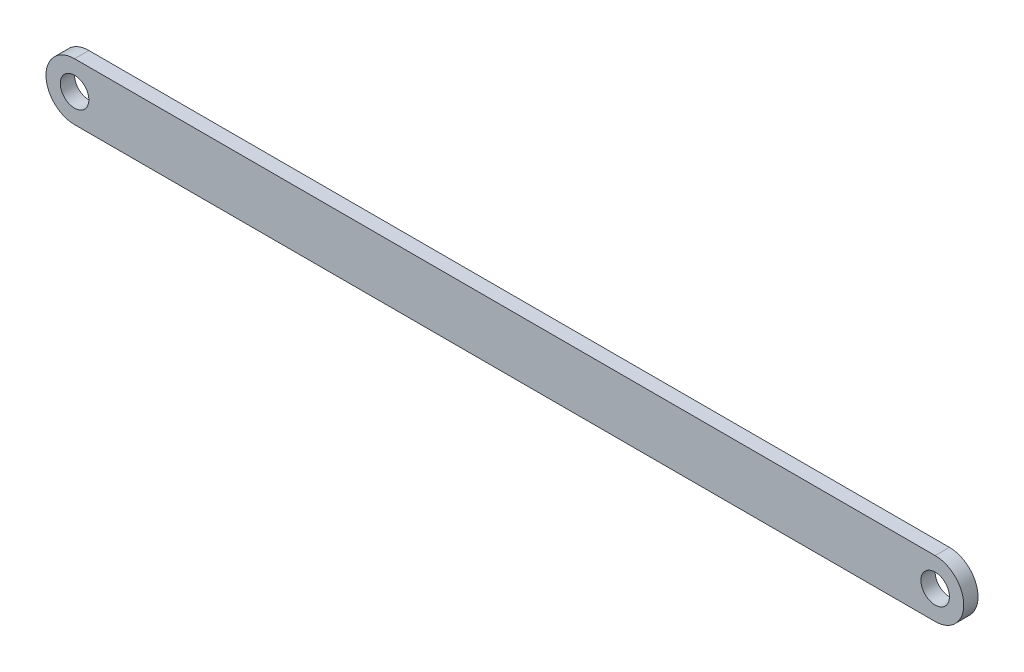
ISO-10303-21;
HEADER;
FILE_DESCRIPTION(('STEP AP214'),'2;1');
FILE_NAME('part.step','',(''),(''),'','','');
FILE_SCHEMA(('AUTOMOTIVE_DESIGN { 1 0 10303 214 1 1 1 1 }'));
ENDSEC;
DATA;
#1=APPLICATION_CONTEXT('core data for automotive mechanical design processes');
#2=APPLICATION_PROTOCOL_DEFINITION('international standard','automotive_design',2000,#1);
#3=PRODUCT_CONTEXT('',#1,'mechanical');
#4=PRODUCT('Part','Part','',(#3));
#5=PRODUCT_RELATED_PRODUCT_CATEGORY('part','',(#4));
#6=PRODUCT_DEFINITION_FORMATION('','',#4);
#7=PRODUCT_DEFINITION_CONTEXT('part definition',#1,'design');
#8=PRODUCT_DEFINITION('design','',#6,#7);
#9=PRODUCT_DEFINITION_SHAPE('','',#8);
#10=(LENGTH_UNIT() NAMED_UNIT(*) SI_UNIT(.MILLI.,.METRE.));
#11=(NAMED_UNIT(*) PLANE_ANGLE_UNIT() SI_UNIT($,.RADIAN.));
#12=(NAMED_UNIT(*) SI_UNIT($,.STERADIAN.) SOLID_ANGLE_UNIT());
#13=UNCERTAINTY_MEASURE_WITH_UNIT(LENGTH_MEASURE(1.E-05),#10,'distance_accuracy_value','');
#14=(GEOMETRIC_REPRESENTATION_CONTEXT(3) GLOBAL_UNCERTAINTY_ASSIGNED_CONTEXT((#13)) GLOBAL_UNIT_ASSIGNED_CONTEXT((#10,
#11,#12)) REPRESENTATION_CONTEXT('',''));
#15=CARTESIAN_POINT('',(0.,0.,0.));
#16=DIRECTION('',(0.,0.,1.));
#17=DIRECTION('',(1.,0.,0.));
#18=AXIS2_PLACEMENT_3D('',#15,#16,#17);
#19=CARTESIAN_POINT('',(30.13,0.,1.));
#20=DIRECTION('',(0.,0.,-1.));
#21=DIRECTION('',(-1.,0.,0.));
#22=AXIS2_PLACEMENT_3D('',#19,#20,#21);
#23=PLANE('',#22);
#24=CARTESIAN_POINT('',(30.13,0.,1.));
#25=DIRECTION('',(0.,0.,1.));
#26=DIRECTION('',(-1.,0.,0.));
#27=AXIS2_PLACEMENT_3D('',#24,#25,#26);
#28=CIRCLE('',#27,2.);
#29=CARTESIAN_POINT('',(30.13,-2.,1.));
#30=VERTEX_POINT('',#29);
#31=CARTESIAN_POINT('',(30.13,2.,1.));
#32=VERTEX_POINT('',#31);
#33=EDGE_CURVE('E96',#30,#32,#28,.T.);
#34=ORIENTED_EDGE('',*,*,#33,.T.);
#35=DIRECTION('',(-1.,0.,0.));
#36=VECTOR('',#35,1.);
#37=CARTESIAN_POINT('',(-30.13,2.,1.));
#38=LINE('',#37,#36);
#39=CARTESIAN_POINT('',(-30.13,2.,1.));
#40=VERTEX_POINT('',#39);
#41=EDGE_CURVE('E91',#32,#40,#38,.T.);
#42=ORIENTED_EDGE('',*,*,#41,.T.);
#43=CARTESIAN_POINT('',(-30.13,0.,1.));
#44=DIRECTION('',(0.,0.,1.));
#45=DIRECTION('',(1.,0.,0.));
#46=AXIS2_PLACEMENT_3D('',#43,#44,#45);
#47=CIRCLE('',#46,2.);
#48=CARTESIAN_POINT('',(-30.13,-2.,1.));
#49=VERTEX_POINT('',#48);
#50=EDGE_CURVE('E94',#40,#49,#47,.T.);
#51=ORIENTED_EDGE('',*,*,#50,.T.);
#52=DIRECTION('',(1.,0.,0.));
#53=VECTOR('',#52,1.);
#54=CARTESIAN_POINT('',(-30.13,-2.,1.));
#55=LINE('',#54,#53);
#56=EDGE_CURVE('E61',#49,#30,#55,.T.);
#57=ORIENTED_EDGE('',*,*,#56,.T.);
#58=EDGE_LOOP('',(#34,#42,#51,#57));
#59=FACE_BOUND('',#58,.T.);
#60=CARTESIAN_POINT('',(-30.13,0.,1.));
#61=DIRECTION('',(0.,0.,1.));
#62=DIRECTION('',(1.,0.,0.));
#63=AXIS2_PLACEMENT_3D('',#60,#61,#62);
#64=CIRCLE('',#63,1.);
#65=CARTESIAN_POINT('',(-29.13,0.,1.));
#66=VERTEX_POINT('',#65);
#67=EDGE_CURVE('E116',#66,#66,#64,.T.);
#68=ORIENTED_EDGE('',*,*,#67,.F.);
#69=EDGE_LOOP('',(#68));
#70=FACE_BOUND('',#69,.T.);
#71=CARTESIAN_POINT('',(30.13,0.,1.));
#72=DIRECTION('',(0.,0.,1.));
#73=DIRECTION('',(1.,0.,0.));
#74=AXIS2_PLACEMENT_3D('',#71,#72,#73);
#75=CIRCLE('',#74,1.);
#76=CARTESIAN_POINT('',(31.13,0.,1.));
#77=VERTEX_POINT('',#76);
#78=EDGE_CURVE('E138',#77,#77,#75,.T.);
#79=ORIENTED_EDGE('',*,*,#78,.F.);
#80=EDGE_LOOP('',(#79));
#81=FACE_BOUND('',#80,.T.);
#82=ADVANCED_FACE('F43',(#59,#70,#81),#23,.F.);
#83=CARTESIAN_POINT('',(30.13,0.,0.));
#84=DIRECTION('',(0.,0.,-1.));
#85=DIRECTION('',(-1.,0.,0.));
#86=AXIS2_PLACEMENT_3D('',#83,#84,#85);
#87=PLANE('',#86);
#88=CARTESIAN_POINT('',(-30.13,0.,0.));
#89=DIRECTION('',(0.,0.,1.));
#90=DIRECTION('',(1.,0.,0.));
#91=AXIS2_PLACEMENT_3D('',#88,#89,#90);
#92=CIRCLE('',#91,1.);
#93=CARTESIAN_POINT('',(-29.13,0.,0.));
#94=VERTEX_POINT('',#93);
#95=EDGE_CURVE('E134',#94,#94,#92,.T.);
#96=ORIENTED_EDGE('',*,*,#95,.T.);
#97=EDGE_LOOP('',(#96));
#98=FACE_BOUND('',#97,.T.);
#99=CARTESIAN_POINT('',(30.13,0.,0.));
#100=DIRECTION('',(0.,0.,1.));
#101=DIRECTION('',(-1.,0.,0.));
#102=AXIS2_PLACEMENT_3D('',#99,#100,#101);
#103=CIRCLE('',#102,2.);
#104=CARTESIAN_POINT('',(30.13,-2.,0.));
#105=VERTEX_POINT('',#104);
#106=CARTESIAN_POINT('',(30.13,2.,0.));
#107=VERTEX_POINT('',#106);
#108=EDGE_CURVE('E112',#105,#107,#103,.T.);
#109=ORIENTED_EDGE('',*,*,#108,.F.);
#110=DIRECTION('',(1.,0.,0.));
#111=VECTOR('',#110,1.);
#112=CARTESIAN_POINT('',(-30.13,-2.,0.));
#113=LINE('',#112,#111);
#114=CARTESIAN_POINT('',(-30.13,-2.,0.));
#115=VERTEX_POINT('',#114);
#116=EDGE_CURVE('E84',#115,#105,#113,.T.);
#117=ORIENTED_EDGE('',*,*,#116,.F.);
#118=CARTESIAN_POINT('',(-30.13,0.,0.));
#119=DIRECTION('',(0.,0.,1.));
#120=DIRECTION('',(1.,0.,0.));
#121=AXIS2_PLACEMENT_3D('',#118,#119,#120);
#122=CIRCLE('',#121,2.);
#123=CARTESIAN_POINT('',(-30.13,2.,0.));
#124=VERTEX_POINT('',#123);
#125=EDGE_CURVE('E78',#124,#115,#122,.T.);
#126=ORIENTED_EDGE('',*,*,#125,.F.);
#127=DIRECTION('',(-1.,0.,0.));
#128=VECTOR('',#127,1.);
#129=CARTESIAN_POINT('',(-30.13,2.,0.));
#130=LINE('',#129,#128);
#131=EDGE_CURVE('E101',#107,#124,#130,.T.);
#132=ORIENTED_EDGE('',*,*,#131,.F.);
#133=EDGE_LOOP('',(#109,#117,#126,#132));
#134=FACE_BOUND('',#133,.T.);
#135=CARTESIAN_POINT('',(30.13,0.,0.));
#136=DIRECTION('',(0.,0.,1.));
#137=DIRECTION('',(1.,0.,0.));
#138=AXIS2_PLACEMENT_3D('',#135,#136,#137);
#139=CIRCLE('',#138,1.);
#140=CARTESIAN_POINT('',(31.13,0.,0.));
#141=VERTEX_POINT('',#140);
#142=EDGE_CURVE('E142',#141,#141,#139,.T.);
#143=ORIENTED_EDGE('',*,*,#142,.T.);
#144=EDGE_LOOP('',(#143));
#145=FACE_BOUND('',#144,.T.);
#146=ADVANCED_FACE('F129',(#98,#134,#145),#87,.T.);
#147=CARTESIAN_POINT('',(30.13,0.,1.));
#148=DIRECTION('',(0.,0.,-1.));
#149=DIRECTION('',(-1.,0.,0.));
#150=AXIS2_PLACEMENT_3D('',#147,#148,#149);
#151=CYLINDRICAL_SURFACE('',#150,2.);
#152=ORIENTED_EDGE('',*,*,#108,.T.);
#153=DIRECTION('',(0.,0.,-1.));
#154=VECTOR('',#153,1.);
#155=CARTESIAN_POINT('',(30.13,2.,1.));
#156=LINE('',#155,#154);
#157=EDGE_CURVE('E11',#32,#107,#156,.T.);
#158=ORIENTED_EDGE('',*,*,#157,.F.);
#159=ORIENTED_EDGE('',*,*,#33,.F.);
#160=DIRECTION('',(0.,0.,-1.));
#161=VECTOR('',#160,1.);
#162=CARTESIAN_POINT('',(30.13,-2.,1.));
#163=LINE('',#162,#161);
#164=EDGE_CURVE('E108',#30,#105,#163,.T.);
#165=ORIENTED_EDGE('',*,*,#164,.T.);
#166=EDGE_LOOP('',(#152,#158,#159,#165));
#167=FACE_BOUND('',#166,.T.);
#168=ADVANCED_FACE('F45',(#167),#151,.T.);
#169=CARTESIAN_POINT('',(-30.13,2.,1.));
#170=DIRECTION('',(0.,-1.,0.));
#171=DIRECTION('',(0.,0.,-1.));
#172=AXIS2_PLACEMENT_3D('',#169,#170,#171);
#173=PLANE('',#172);
#174=ORIENTED_EDGE('',*,*,#131,.T.);
#175=DIRECTION('',(0.,0.,-1.));
#176=VECTOR('',#175,1.);
#177=CARTESIAN_POINT('',(-30.13,2.,1.));
#178=LINE('',#177,#176);
#179=EDGE_CURVE('E53',#40,#124,#178,.T.);
#180=ORIENTED_EDGE('',*,*,#179,.F.);
#181=ORIENTED_EDGE('',*,*,#41,.F.);
#182=ORIENTED_EDGE('',*,*,#157,.T.);
#183=EDGE_LOOP('',(#174,#180,#181,#182));
#184=FACE_BOUND('',#183,.T.);
#185=ADVANCED_FACE('F100',(#184),#173,.F.);
#186=CARTESIAN_POINT('',(-30.13,0.,1.));
#187=DIRECTION('',(0.,0.,-1.));
#188=DIRECTION('',(-1.,0.,0.));
#189=AXIS2_PLACEMENT_3D('',#186,#187,#188);
#190=CYLINDRICAL_SURFACE('',#189,2.);
#191=ORIENTED_EDGE('',*,*,#125,.T.);
#192=DIRECTION('',(0.,0.,-1.));
#193=VECTOR('',#192,1.);
#194=CARTESIAN_POINT('',(-30.13,-2.,1.));
#195=LINE('',#194,#193);
#196=EDGE_CURVE('E103',#49,#115,#195,.T.);
#197=ORIENTED_EDGE('',*,*,#196,.F.);
#198=ORIENTED_EDGE('',*,*,#50,.F.);
#199=ORIENTED_EDGE('',*,*,#179,.T.);
#200=EDGE_LOOP('',(#191,#197,#198,#199));
#201=FACE_BOUND('',#200,.T.);
#202=ADVANCED_FACE('F104',(#201),#190,.T.);
#203=CARTESIAN_POINT('',(-30.13,-2.,1.));
#204=DIRECTION('',(0.,1.,0.));
#205=DIRECTION('',(0.,0.,1.));
#206=AXIS2_PLACEMENT_3D('',#203,#204,#205);
#207=PLANE('',#206);
#208=ORIENTED_EDGE('',*,*,#116,.T.);
#209=ORIENTED_EDGE('',*,*,#164,.F.);
#210=ORIENTED_EDGE('',*,*,#56,.F.);
#211=ORIENTED_EDGE('',*,*,#196,.T.);
#212=EDGE_LOOP('',(#208,#209,#210,#211));
#213=FACE_BOUND('',#212,.T.);
#214=ADVANCED_FACE('F126',(#213),#207,.F.);
#215=CARTESIAN_POINT('',(-30.13,0.,1.));
#216=DIRECTION('',(0.,0.,-1.));
#217=DIRECTION('',(-1.,0.,0.));
#218=AXIS2_PLACEMENT_3D('',#215,#216,#217);
#219=CYLINDRICAL_SURFACE('',#218,1.);
#220=ORIENTED_EDGE('',*,*,#67,.T.);
#221=EDGE_LOOP('',(#220));
#222=FACE_BOUND('',#221,.T.);
#223=ORIENTED_EDGE('',*,*,#95,.F.);
#224=EDGE_LOOP('',(#223));
#225=FACE_BOUND('',#224,.T.);
#226=ADVANCED_FACE('F161',(#222,#225),#219,.F.);
#227=CARTESIAN_POINT('',(30.13,0.,1.));
#228=DIRECTION('',(0.,0.,-1.));
#229=DIRECTION('',(-1.,0.,0.));
#230=AXIS2_PLACEMENT_3D('',#227,#228,#229);
#231=CYLINDRICAL_SURFACE('',#230,1.);
#232=ORIENTED_EDGE('',*,*,#78,.T.);
#233=EDGE_LOOP('',(#232));
#234=FACE_BOUND('',#233,.T.);
#235=ORIENTED_EDGE('',*,*,#142,.F.);
#236=EDGE_LOOP('',(#235));
#237=FACE_BOUND('',#236,.T.);
#238=ADVANCED_FACE('F150',(#234,#237),#231,.F.);
#239=CLOSED_SHELL('',(#82,#146,#168,#185,#202,#214,#226,#238));
#240=MANIFOLD_SOLID_BREP('B2',#239);
#241=ADVANCED_BREP_SHAPE_REPRESENTATION('',(#18,#240),#14);
#242=SHAPE_DEFINITION_REPRESENTATION(#9,#241);
ENDSEC;
END-ISO-10303-21;
